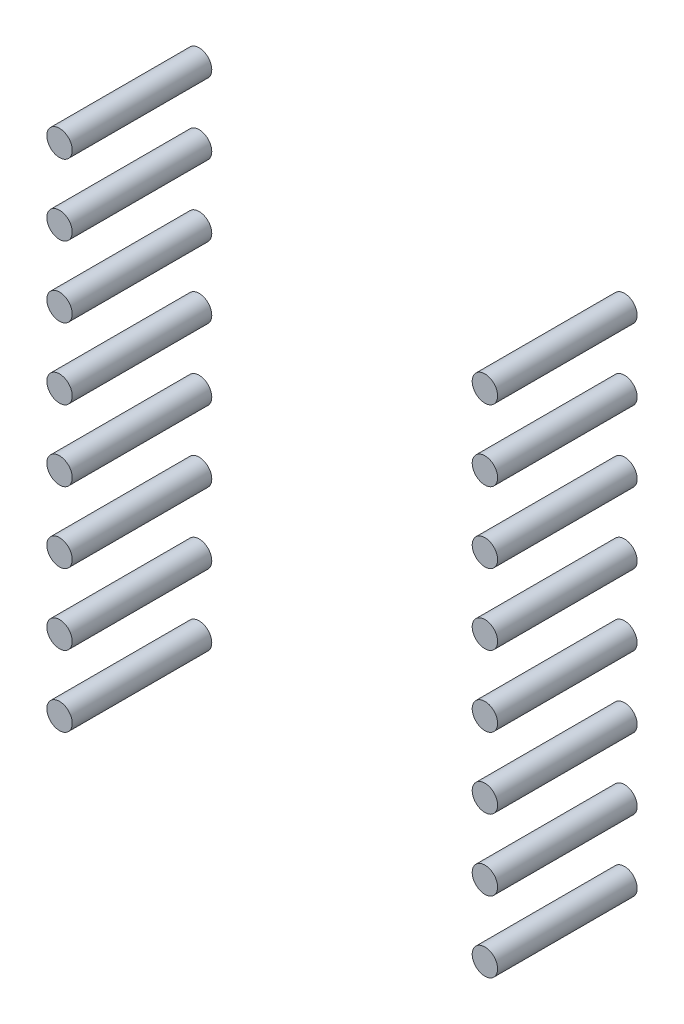
ISO-10303-21;
HEADER;
FILE_DESCRIPTION(('STEP AP214'),'2;1');
FILE_NAME('part.step','',(''),(''),'','','');
FILE_SCHEMA(('AUTOMOTIVE_DESIGN { 1 0 10303 214 1 1 1 1 }'));
ENDSEC;
DATA;
#1=APPLICATION_CONTEXT('core data for automotive mechanical design processes');
#2=APPLICATION_PROTOCOL_DEFINITION('international standard','automotive_design',2000,#1);
#3=PRODUCT_CONTEXT('',#1,'mechanical');
#4=PRODUCT('Part','Part','',(#3));
#5=PRODUCT_RELATED_PRODUCT_CATEGORY('part','',(#4));
#6=PRODUCT_DEFINITION_FORMATION('','',#4);
#7=PRODUCT_DEFINITION_CONTEXT('part definition',#1,'design');
#8=PRODUCT_DEFINITION('design','',#6,#7);
#9=PRODUCT_DEFINITION_SHAPE('','',#8);
#10=(LENGTH_UNIT() NAMED_UNIT(*) SI_UNIT(.MILLI.,.METRE.));
#11=(NAMED_UNIT(*) PLANE_ANGLE_UNIT() SI_UNIT($,.RADIAN.));
#12=(NAMED_UNIT(*) SI_UNIT($,.STERADIAN.) SOLID_ANGLE_UNIT());
#13=UNCERTAINTY_MEASURE_WITH_UNIT(LENGTH_MEASURE(1.E-05),#10,'distance_accuracy_value','');
#14=(GEOMETRIC_REPRESENTATION_CONTEXT(3) GLOBAL_UNCERTAINTY_ASSIGNED_CONTEXT((#13)) GLOBAL_UNIT_ASSIGNED_CONTEXT((#10,
#11,#12)) REPRESENTATION_CONTEXT('',''));
#15=CARTESIAN_POINT('',(0.,0.,0.));
#16=DIRECTION('',(0.,0.,1.));
#17=DIRECTION('',(1.,0.,0.));
#18=AXIS2_PLACEMENT_3D('',#15,#16,#17);
#19=CARTESIAN_POINT('',(0.,-7.62,0.));
#20=DIRECTION('',(0.,0.,1.));
#21=DIRECTION('',(1.,0.,0.));
#22=AXIS2_PLACEMENT_3D('',#19,#20,#21);
#23=PLANE('',#22);
#24=CARTESIAN_POINT('',(0.,-7.62,0.));
#25=DIRECTION('',(0.,0.,1.));
#26=DIRECTION('',(1.,0.,0.));
#27=AXIS2_PLACEMENT_3D('',#24,#25,#26);
#28=CIRCLE('',#27,0.455);
#29=CARTESIAN_POINT('',(0.455,-7.62,0.));
#30=VERTEX_POINT('',#29);
#31=EDGE_CURVE('P0_E18',#30,#30,#28,.F.);
#32=ORIENTED_EDGE('',*,*,#31,.F.);
#33=EDGE_LOOP('',(#32));
#34=FACE_BOUND('',#33,.T.);
#35=ADVANCED_FACE('P0_F15',(#34),#23,.T.);
#36=CARTESIAN_POINT('',(0.,-7.62,-5.));
#37=DIRECTION('',(0.,0.,1.));
#38=DIRECTION('',(1.,0.,0.));
#39=AXIS2_PLACEMENT_3D('',#36,#37,#38);
#40=PLANE('',#39);
#41=CARTESIAN_POINT('',(0.,-7.62,-5.));
#42=DIRECTION('',(0.,0.,1.));
#43=DIRECTION('',(1.,0.,0.));
#44=AXIS2_PLACEMENT_3D('',#41,#42,#43);
#45=CIRCLE('',#44,0.455);
#46=CARTESIAN_POINT('',(0.455,-7.62,-5.));
#47=VERTEX_POINT('',#46);
#48=EDGE_CURVE('P0_E10',#47,#47,#45,.T.);
#49=ORIENTED_EDGE('',*,*,#48,.F.);
#50=EDGE_LOOP('',(#49));
#51=FACE_BOUND('',#50,.T.);
#52=ADVANCED_FACE('P0_F30',(#51),#40,.F.);
#53=CARTESIAN_POINT('',(0.,-7.62,-5.));
#54=DIRECTION('',(0.,0.,1.));
#55=DIRECTION('',(1.,0.,0.));
#56=AXIS2_PLACEMENT_3D('',#53,#54,#55);
#57=CYLINDRICAL_SURFACE('',#56,0.455);
#58=ORIENTED_EDGE('',*,*,#48,.T.);
#59=EDGE_LOOP('',(#58));
#60=FACE_BOUND('',#59,.T.);
#61=ORIENTED_EDGE('',*,*,#31,.T.);
#62=EDGE_LOOP('',(#61));
#63=FACE_BOUND('',#62,.T.);
#64=ADVANCED_FACE('P0_F27',(#60,#63),#57,.T.);
#65=CLOSED_SHELL('',(#35,#52,#64));
#66=MANIFOLD_SOLID_BREP('P0_B1',#65);
#67=CARTESIAN_POINT('',(15.24,0.,0.));
#68=DIRECTION('',(0.,0.,1.));
#69=DIRECTION('',(1.,0.,0.));
#70=AXIS2_PLACEMENT_3D('',#67,#68,#69);
#71=PLANE('',#70);
#72=CARTESIAN_POINT('',(15.24,0.,0.));
#73=DIRECTION('',(0.,0.,1.));
#74=DIRECTION('',(1.,0.,0.));
#75=AXIS2_PLACEMENT_3D('',#72,#73,#74);
#76=CIRCLE('',#75,0.455);
#77=CARTESIAN_POINT('',(15.695,0.,0.));
#78=VERTEX_POINT('',#77);
#79=EDGE_CURVE('P1_E18',#78,#78,#76,.F.);
#80=ORIENTED_EDGE('',*,*,#79,.F.);
#81=EDGE_LOOP('',(#80));
#82=FACE_BOUND('',#81,.T.);
#83=ADVANCED_FACE('P1_F15',(#82),#71,.T.);
#84=CARTESIAN_POINT('',(15.24,0.,-5.));
#85=DIRECTION('',(0.,0.,1.));
#86=DIRECTION('',(1.,0.,0.));
#87=AXIS2_PLACEMENT_3D('',#84,#85,#86);
#88=PLANE('',#87);
#89=CARTESIAN_POINT('',(15.24,0.,-5.));
#90=DIRECTION('',(0.,0.,1.));
#91=DIRECTION('',(1.,0.,0.));
#92=AXIS2_PLACEMENT_3D('',#89,#90,#91);
#93=CIRCLE('',#92,0.455);
#94=CARTESIAN_POINT('',(15.695,0.,-5.));
#95=VERTEX_POINT('',#94);
#96=EDGE_CURVE('P1_E10',#95,#95,#93,.T.);
#97=ORIENTED_EDGE('',*,*,#96,.F.);
#98=EDGE_LOOP('',(#97));
#99=FACE_BOUND('',#98,.T.);
#100=ADVANCED_FACE('P1_F30',(#99),#88,.F.);
#101=CARTESIAN_POINT('',(15.24,0.,-5.));
#102=DIRECTION('',(0.,0.,1.));
#103=DIRECTION('',(1.,0.,0.));
#104=AXIS2_PLACEMENT_3D('',#101,#102,#103);
#105=CYLINDRICAL_SURFACE('',#104,0.455);
#106=ORIENTED_EDGE('',*,*,#96,.T.);
#107=EDGE_LOOP('',(#106));
#108=FACE_BOUND('',#107,.T.);
#109=ORIENTED_EDGE('',*,*,#79,.T.);
#110=EDGE_LOOP('',(#109));
#111=FACE_BOUND('',#110,.T.);
#112=ADVANCED_FACE('P1_F27',(#108,#111),#105,.T.);
#113=CLOSED_SHELL('',(#83,#100,#112));
#114=MANIFOLD_SOLID_BREP('P1_B1',#113);
#115=CARTESIAN_POINT('',(15.24,-5.08,0.));
#116=DIRECTION('',(0.,0.,1.));
#117=DIRECTION('',(1.,0.,0.));
#118=AXIS2_PLACEMENT_3D('',#115,#116,#117);
#119=PLANE('',#118);
#120=CARTESIAN_POINT('',(15.24,-5.08,0.));
#121=DIRECTION('',(0.,0.,1.));
#122=DIRECTION('',(1.,0.,0.));
#123=AXIS2_PLACEMENT_3D('',#120,#121,#122);
#124=CIRCLE('',#123,0.455);
#125=CARTESIAN_POINT('',(15.695,-5.08,0.));
#126=VERTEX_POINT('',#125);
#127=EDGE_CURVE('P2_E18',#126,#126,#124,.F.);
#128=ORIENTED_EDGE('',*,*,#127,.F.);
#129=EDGE_LOOP('',(#128));
#130=FACE_BOUND('',#129,.T.);
#131=ADVANCED_FACE('P2_F15',(#130),#119,.T.);
#132=CARTESIAN_POINT('',(15.24,-5.08,-5.));
#133=DIRECTION('',(0.,0.,1.));
#134=DIRECTION('',(1.,0.,0.));
#135=AXIS2_PLACEMENT_3D('',#132,#133,#134);
#136=PLANE('',#135);
#137=CARTESIAN_POINT('',(15.24,-5.08,-5.));
#138=DIRECTION('',(0.,0.,1.));
#139=DIRECTION('',(1.,0.,0.));
#140=AXIS2_PLACEMENT_3D('',#137,#138,#139);
#141=CIRCLE('',#140,0.455);
#142=CARTESIAN_POINT('',(15.695,-5.08,-5.));
#143=VERTEX_POINT('',#142);
#144=EDGE_CURVE('P2_E10',#143,#143,#141,.T.);
#145=ORIENTED_EDGE('',*,*,#144,.F.);
#146=EDGE_LOOP('',(#145));
#147=FACE_BOUND('',#146,.T.);
#148=ADVANCED_FACE('P2_F30',(#147),#136,.F.);
#149=CARTESIAN_POINT('',(15.24,-5.08,-5.));
#150=DIRECTION('',(0.,0.,1.));
#151=DIRECTION('',(1.,0.,0.));
#152=AXIS2_PLACEMENT_3D('',#149,#150,#151);
#153=CYLINDRICAL_SURFACE('',#152,0.455);
#154=ORIENTED_EDGE('',*,*,#144,.T.);
#155=EDGE_LOOP('',(#154));
#156=FACE_BOUND('',#155,.T.);
#157=ORIENTED_EDGE('',*,*,#127,.T.);
#158=EDGE_LOOP('',(#157));
#159=FACE_BOUND('',#158,.T.);
#160=ADVANCED_FACE('P2_F27',(#156,#159),#153,.T.);
#161=CLOSED_SHELL('',(#131,#148,#160));
#162=MANIFOLD_SOLID_BREP('P2_B1',#161);
#163=CARTESIAN_POINT('',(15.24,-10.16,0.));
#164=DIRECTION('',(0.,0.,1.));
#165=DIRECTION('',(1.,0.,0.));
#166=AXIS2_PLACEMENT_3D('',#163,#164,#165);
#167=PLANE('',#166);
#168=CARTESIAN_POINT('',(15.24,-10.16,0.));
#169=DIRECTION('',(0.,0.,1.));
#170=DIRECTION('',(1.,0.,0.));
#171=AXIS2_PLACEMENT_3D('',#168,#169,#170);
#172=CIRCLE('',#171,0.455);
#173=CARTESIAN_POINT('',(15.695,-10.16,0.));
#174=VERTEX_POINT('',#173);
#175=EDGE_CURVE('P3_E18',#174,#174,#172,.F.);
#176=ORIENTED_EDGE('',*,*,#175,.F.);
#177=EDGE_LOOP('',(#176));
#178=FACE_BOUND('',#177,.T.);
#179=ADVANCED_FACE('P3_F15',(#178),#167,.T.);
#180=CARTESIAN_POINT('',(15.24,-10.16,-5.));
#181=DIRECTION('',(0.,0.,1.));
#182=DIRECTION('',(1.,0.,0.));
#183=AXIS2_PLACEMENT_3D('',#180,#181,#182);
#184=PLANE('',#183);
#185=CARTESIAN_POINT('',(15.24,-10.16,-5.));
#186=DIRECTION('',(0.,0.,1.));
#187=DIRECTION('',(1.,0.,0.));
#188=AXIS2_PLACEMENT_3D('',#185,#186,#187);
#189=CIRCLE('',#188,0.455);
#190=CARTESIAN_POINT('',(15.695,-10.16,-5.));
#191=VERTEX_POINT('',#190);
#192=EDGE_CURVE('P3_E10',#191,#191,#189,.T.);
#193=ORIENTED_EDGE('',*,*,#192,.F.);
#194=EDGE_LOOP('',(#193));
#195=FACE_BOUND('',#194,.T.);
#196=ADVANCED_FACE('P3_F30',(#195),#184,.F.);
#197=CARTESIAN_POINT('',(15.24,-10.16,-5.));
#198=DIRECTION('',(0.,0.,1.));
#199=DIRECTION('',(1.,0.,0.));
#200=AXIS2_PLACEMENT_3D('',#197,#198,#199);
#201=CYLINDRICAL_SURFACE('',#200,0.455);
#202=ORIENTED_EDGE('',*,*,#192,.T.);
#203=EDGE_LOOP('',(#202));
#204=FACE_BOUND('',#203,.T.);
#205=ORIENTED_EDGE('',*,*,#175,.T.);
#206=EDGE_LOOP('',(#205));
#207=FACE_BOUND('',#206,.T.);
#208=ADVANCED_FACE('P3_F27',(#204,#207),#201,.T.);
#209=CLOSED_SHELL('',(#179,#196,#208));
#210=MANIFOLD_SOLID_BREP('P3_B1',#209);
#211=CARTESIAN_POINT('',(0.,-2.54,0.));
#212=DIRECTION('',(0.,0.,1.));
#213=DIRECTION('',(1.,0.,0.));
#214=AXIS2_PLACEMENT_3D('',#211,#212,#213);
#215=PLANE('',#214);
#216=CARTESIAN_POINT('',(0.,-2.54,0.));
#217=DIRECTION('',(0.,0.,1.));
#218=DIRECTION('',(1.,0.,0.));
#219=AXIS2_PLACEMENT_3D('',#216,#217,#218);
#220=CIRCLE('',#219,0.455);
#221=CARTESIAN_POINT('',(0.455,-2.54,0.));
#222=VERTEX_POINT('',#221);
#223=EDGE_CURVE('P4_E18',#222,#222,#220,.F.);
#224=ORIENTED_EDGE('',*,*,#223,.F.);
#225=EDGE_LOOP('',(#224));
#226=FACE_BOUND('',#225,.T.);
#227=ADVANCED_FACE('P4_F15',(#226),#215,.T.);
#228=CARTESIAN_POINT('',(0.,-2.54,-5.));
#229=DIRECTION('',(0.,0.,1.));
#230=DIRECTION('',(1.,0.,0.));
#231=AXIS2_PLACEMENT_3D('',#228,#229,#230);
#232=PLANE('',#231);
#233=CARTESIAN_POINT('',(0.,-2.54,-5.));
#234=DIRECTION('',(0.,0.,1.));
#235=DIRECTION('',(1.,0.,0.));
#236=AXIS2_PLACEMENT_3D('',#233,#234,#235);
#237=CIRCLE('',#236,0.455);
#238=CARTESIAN_POINT('',(0.455,-2.54,-5.));
#239=VERTEX_POINT('',#238);
#240=EDGE_CURVE('P4_E10',#239,#239,#237,.T.);
#241=ORIENTED_EDGE('',*,*,#240,.F.);
#242=EDGE_LOOP('',(#241));
#243=FACE_BOUND('',#242,.T.);
#244=ADVANCED_FACE('P4_F30',(#243),#232,.F.);
#245=CARTESIAN_POINT('',(0.,-2.54,-5.));
#246=DIRECTION('',(0.,0.,1.));
#247=DIRECTION('',(1.,0.,0.));
#248=AXIS2_PLACEMENT_3D('',#245,#246,#247);
#249=CYLINDRICAL_SURFACE('',#248,0.455);
#250=ORIENTED_EDGE('',*,*,#240,.T.);
#251=EDGE_LOOP('',(#250));
#252=FACE_BOUND('',#251,.T.);
#253=ORIENTED_EDGE('',*,*,#223,.T.);
#254=EDGE_LOOP('',(#253));
#255=FACE_BOUND('',#254,.T.);
#256=ADVANCED_FACE('P4_F27',(#252,#255),#249,.T.);
#257=CLOSED_SHELL('',(#227,#244,#256));
#258=MANIFOLD_SOLID_BREP('P4_B1',#257);
#259=CARTESIAN_POINT('',(0.,-15.24,0.));
#260=DIRECTION('',(0.,0.,1.));
#261=DIRECTION('',(1.,0.,0.));
#262=AXIS2_PLACEMENT_3D('',#259,#260,#261);
#263=PLANE('',#262);
#264=CARTESIAN_POINT('',(0.,-15.24,0.));
#265=DIRECTION('',(0.,0.,1.));
#266=DIRECTION('',(1.,0.,0.));
#267=AXIS2_PLACEMENT_3D('',#264,#265,#266);
#268=CIRCLE('',#267,0.455);
#269=CARTESIAN_POINT('',(0.455,-15.24,0.));
#270=VERTEX_POINT('',#269);
#271=EDGE_CURVE('P5_E18',#270,#270,#268,.F.);
#272=ORIENTED_EDGE('',*,*,#271,.F.);
#273=EDGE_LOOP('',(#272));
#274=FACE_BOUND('',#273,.T.);
#275=ADVANCED_FACE('P5_F15',(#274),#263,.T.);
#276=CARTESIAN_POINT('',(0.,-15.24,-5.));
#277=DIRECTION('',(0.,0.,1.));
#278=DIRECTION('',(1.,0.,0.));
#279=AXIS2_PLACEMENT_3D('',#276,#277,#278);
#280=PLANE('',#279);
#281=CARTESIAN_POINT('',(0.,-15.24,-5.));
#282=DIRECTION('',(0.,0.,1.));
#283=DIRECTION('',(1.,0.,0.));
#284=AXIS2_PLACEMENT_3D('',#281,#282,#283);
#285=CIRCLE('',#284,0.455);
#286=CARTESIAN_POINT('',(0.455,-15.24,-5.));
#287=VERTEX_POINT('',#286);
#288=EDGE_CURVE('P5_E10',#287,#287,#285,.T.);
#289=ORIENTED_EDGE('',*,*,#288,.F.);
#290=EDGE_LOOP('',(#289));
#291=FACE_BOUND('',#290,.T.);
#292=ADVANCED_FACE('P5_F30',(#291),#280,.F.);
#293=CARTESIAN_POINT('',(0.,-15.24,-5.));
#294=DIRECTION('',(0.,0.,1.));
#295=DIRECTION('',(1.,0.,0.));
#296=AXIS2_PLACEMENT_3D('',#293,#294,#295);
#297=CYLINDRICAL_SURFACE('',#296,0.455);
#298=ORIENTED_EDGE('',*,*,#288,.T.);
#299=EDGE_LOOP('',(#298));
#300=FACE_BOUND('',#299,.T.);
#301=ORIENTED_EDGE('',*,*,#271,.T.);
#302=EDGE_LOOP('',(#301));
#303=FACE_BOUND('',#302,.T.);
#304=ADVANCED_FACE('P5_F27',(#300,#303),#297,.T.);
#305=CLOSED_SHELL('',(#275,#292,#304));
#306=MANIFOLD_SOLID_BREP('P5_B1',#305);
#307=CARTESIAN_POINT('',(15.24,-7.62,0.));
#308=DIRECTION('',(0.,0.,1.));
#309=DIRECTION('',(1.,0.,0.));
#310=AXIS2_PLACEMENT_3D('',#307,#308,#309);
#311=PLANE('',#310);
#312=CARTESIAN_POINT('',(15.24,-7.62,0.));
#313=DIRECTION('',(0.,0.,1.));
#314=DIRECTION('',(1.,0.,0.));
#315=AXIS2_PLACEMENT_3D('',#312,#313,#314);
#316=CIRCLE('',#315,0.455);
#317=CARTESIAN_POINT('',(15.695,-7.62,0.));
#318=VERTEX_POINT('',#317);
#319=EDGE_CURVE('P6_E18',#318,#318,#316,.F.);
#320=ORIENTED_EDGE('',*,*,#319,.F.);
#321=EDGE_LOOP('',(#320));
#322=FACE_BOUND('',#321,.T.);
#323=ADVANCED_FACE('P6_F15',(#322),#311,.T.);
#324=CARTESIAN_POINT('',(15.24,-7.62,-5.));
#325=DIRECTION('',(0.,0.,1.));
#326=DIRECTION('',(1.,0.,0.));
#327=AXIS2_PLACEMENT_3D('',#324,#325,#326);
#328=PLANE('',#327);
#329=CARTESIAN_POINT('',(15.24,-7.62,-5.));
#330=DIRECTION('',(0.,0.,1.));
#331=DIRECTION('',(1.,0.,0.));
#332=AXIS2_PLACEMENT_3D('',#329,#330,#331);
#333=CIRCLE('',#332,0.455);
#334=CARTESIAN_POINT('',(15.695,-7.62,-5.));
#335=VERTEX_POINT('',#334);
#336=EDGE_CURVE('P6_E10',#335,#335,#333,.T.);
#337=ORIENTED_EDGE('',*,*,#336,.F.);
#338=EDGE_LOOP('',(#337));
#339=FACE_BOUND('',#338,.T.);
#340=ADVANCED_FACE('P6_F30',(#339),#328,.F.);
#341=CARTESIAN_POINT('',(15.24,-7.62,-5.));
#342=DIRECTION('',(0.,0.,1.));
#343=DIRECTION('',(1.,0.,0.));
#344=AXIS2_PLACEMENT_3D('',#341,#342,#343);
#345=CYLINDRICAL_SURFACE('',#344,0.455);
#346=ORIENTED_EDGE('',*,*,#336,.T.);
#347=EDGE_LOOP('',(#346));
#348=FACE_BOUND('',#347,.T.);
#349=ORIENTED_EDGE('',*,*,#319,.T.);
#350=EDGE_LOOP('',(#349));
#351=FACE_BOUND('',#350,.T.);
#352=ADVANCED_FACE('P6_F27',(#348,#351),#345,.T.);
#353=CLOSED_SHELL('',(#323,#340,#352));
#354=MANIFOLD_SOLID_BREP('P6_B1',#353);
#355=CARTESIAN_POINT('',(0.,-5.08,0.));
#356=DIRECTION('',(0.,0.,1.));
#357=DIRECTION('',(1.,0.,0.));
#358=AXIS2_PLACEMENT_3D('',#355,#356,#357);
#359=PLANE('',#358);
#360=CARTESIAN_POINT('',(0.,-5.08,0.));
#361=DIRECTION('',(0.,0.,1.));
#362=DIRECTION('',(1.,0.,0.));
#363=AXIS2_PLACEMENT_3D('',#360,#361,#362);
#364=CIRCLE('',#363,0.455);
#365=CARTESIAN_POINT('',(0.455,-5.08,0.));
#366=VERTEX_POINT('',#365);
#367=EDGE_CURVE('P7_E18',#366,#366,#364,.F.);
#368=ORIENTED_EDGE('',*,*,#367,.F.);
#369=EDGE_LOOP('',(#368));
#370=FACE_BOUND('',#369,.T.);
#371=ADVANCED_FACE('P7_F15',(#370),#359,.T.);
#372=CARTESIAN_POINT('',(0.,-5.08,-5.));
#373=DIRECTION('',(0.,0.,1.));
#374=DIRECTION('',(1.,0.,0.));
#375=AXIS2_PLACEMENT_3D('',#372,#373,#374);
#376=PLANE('',#375);
#377=CARTESIAN_POINT('',(0.,-5.08,-5.));
#378=DIRECTION('',(0.,0.,1.));
#379=DIRECTION('',(1.,0.,0.));
#380=AXIS2_PLACEMENT_3D('',#377,#378,#379);
#381=CIRCLE('',#380,0.455);
#382=CARTESIAN_POINT('',(0.455,-5.08,-5.));
#383=VERTEX_POINT('',#382);
#384=EDGE_CURVE('P7_E10',#383,#383,#381,.T.);
#385=ORIENTED_EDGE('',*,*,#384,.F.);
#386=EDGE_LOOP('',(#385));
#387=FACE_BOUND('',#386,.T.);
#388=ADVANCED_FACE('P7_F30',(#387),#376,.F.);
#389=CARTESIAN_POINT('',(0.,-5.08,-5.));
#390=DIRECTION('',(0.,0.,1.));
#391=DIRECTION('',(1.,0.,0.));
#392=AXIS2_PLACEMENT_3D('',#389,#390,#391);
#393=CYLINDRICAL_SURFACE('',#392,0.455);
#394=ORIENTED_EDGE('',*,*,#384,.T.);
#395=EDGE_LOOP('',(#394));
#396=FACE_BOUND('',#395,.T.);
#397=ORIENTED_EDGE('',*,*,#367,.T.);
#398=EDGE_LOOP('',(#397));
#399=FACE_BOUND('',#398,.T.);
#400=ADVANCED_FACE('P7_F27',(#396,#399),#393,.T.);
#401=CLOSED_SHELL('',(#371,#388,#400));
#402=MANIFOLD_SOLID_BREP('P7_B1',#401);
#403=CARTESIAN_POINT('',(0.,-12.7,0.));
#404=DIRECTION('',(0.,0.,1.));
#405=DIRECTION('',(1.,0.,0.));
#406=AXIS2_PLACEMENT_3D('',#403,#404,#405);
#407=PLANE('',#406);
#408=CARTESIAN_POINT('',(0.,-12.7,0.));
#409=DIRECTION('',(0.,0.,1.));
#410=DIRECTION('',(1.,0.,0.));
#411=AXIS2_PLACEMENT_3D('',#408,#409,#410);
#412=CIRCLE('',#411,0.455);
#413=CARTESIAN_POINT('',(0.455,-12.7,0.));
#414=VERTEX_POINT('',#413);
#415=EDGE_CURVE('P8_E18',#414,#414,#412,.F.);
#416=ORIENTED_EDGE('',*,*,#415,.F.);
#417=EDGE_LOOP('',(#416));
#418=FACE_BOUND('',#417,.T.);
#419=ADVANCED_FACE('P8_F15',(#418),#407,.T.);
#420=CARTESIAN_POINT('',(0.,-12.7,-5.));
#421=DIRECTION('',(0.,0.,1.));
#422=DIRECTION('',(1.,0.,0.));
#423=AXIS2_PLACEMENT_3D('',#420,#421,#422);
#424=PLANE('',#423);
#425=CARTESIAN_POINT('',(0.,-12.7,-5.));
#426=DIRECTION('',(0.,0.,1.));
#427=DIRECTION('',(1.,0.,0.));
#428=AXIS2_PLACEMENT_3D('',#425,#426,#427);
#429=CIRCLE('',#428,0.455);
#430=CARTESIAN_POINT('',(0.455,-12.7,-5.));
#431=VERTEX_POINT('',#430);
#432=EDGE_CURVE('P8_E10',#431,#431,#429,.T.);
#433=ORIENTED_EDGE('',*,*,#432,.F.);
#434=EDGE_LOOP('',(#433));
#435=FACE_BOUND('',#434,.T.);
#436=ADVANCED_FACE('P8_F30',(#435),#424,.F.);
#437=CARTESIAN_POINT('',(0.,-12.7,-5.));
#438=DIRECTION('',(0.,0.,1.));
#439=DIRECTION('',(1.,0.,0.));
#440=AXIS2_PLACEMENT_3D('',#437,#438,#439);
#441=CYLINDRICAL_SURFACE('',#440,0.455);
#442=ORIENTED_EDGE('',*,*,#432,.T.);
#443=EDGE_LOOP('',(#442));
#444=FACE_BOUND('',#443,.T.);
#445=ORIENTED_EDGE('',*,*,#415,.T.);
#446=EDGE_LOOP('',(#445));
#447=FACE_BOUND('',#446,.T.);
#448=ADVANCED_FACE('P8_F27',(#444,#447),#441,.T.);
#449=CLOSED_SHELL('',(#419,#436,#448));
#450=MANIFOLD_SOLID_BREP('P8_B1',#449);
#451=CARTESIAN_POINT('',(15.24,-2.54,0.));
#452=DIRECTION('',(0.,0.,1.));
#453=DIRECTION('',(1.,0.,0.));
#454=AXIS2_PLACEMENT_3D('',#451,#452,#453);
#455=PLANE('',#454);
#456=CARTESIAN_POINT('',(15.24,-2.54,0.));
#457=DIRECTION('',(0.,0.,1.));
#458=DIRECTION('',(1.,0.,0.));
#459=AXIS2_PLACEMENT_3D('',#456,#457,#458);
#460=CIRCLE('',#459,0.455);
#461=CARTESIAN_POINT('',(15.695,-2.54,0.));
#462=VERTEX_POINT('',#461);
#463=EDGE_CURVE('P9_E18',#462,#462,#460,.F.);
#464=ORIENTED_EDGE('',*,*,#463,.F.);
#465=EDGE_LOOP('',(#464));
#466=FACE_BOUND('',#465,.T.);
#467=ADVANCED_FACE('P9_F15',(#466),#455,.T.);
#468=CARTESIAN_POINT('',(15.24,-2.54,-5.));
#469=DIRECTION('',(0.,0.,1.));
#470=DIRECTION('',(1.,0.,0.));
#471=AXIS2_PLACEMENT_3D('',#468,#469,#470);
#472=PLANE('',#471);
#473=CARTESIAN_POINT('',(15.24,-2.54,-5.));
#474=DIRECTION('',(0.,0.,1.));
#475=DIRECTION('',(1.,0.,0.));
#476=AXIS2_PLACEMENT_3D('',#473,#474,#475);
#477=CIRCLE('',#476,0.455);
#478=CARTESIAN_POINT('',(15.695,-2.54,-5.));
#479=VERTEX_POINT('',#478);
#480=EDGE_CURVE('P9_E10',#479,#479,#477,.T.);
#481=ORIENTED_EDGE('',*,*,#480,.F.);
#482=EDGE_LOOP('',(#481));
#483=FACE_BOUND('',#482,.T.);
#484=ADVANCED_FACE('P9_F30',(#483),#472,.F.);
#485=CARTESIAN_POINT('',(15.24,-2.54,-5.));
#486=DIRECTION('',(0.,0.,1.));
#487=DIRECTION('',(1.,0.,0.));
#488=AXIS2_PLACEMENT_3D('',#485,#486,#487);
#489=CYLINDRICAL_SURFACE('',#488,0.455);
#490=ORIENTED_EDGE('',*,*,#480,.T.);
#491=EDGE_LOOP('',(#490));
#492=FACE_BOUND('',#491,.T.);
#493=ORIENTED_EDGE('',*,*,#463,.T.);
#494=EDGE_LOOP('',(#493));
#495=FACE_BOUND('',#494,.T.);
#496=ADVANCED_FACE('P9_F27',(#492,#495),#489,.T.);
#497=CLOSED_SHELL('',(#467,#484,#496));
#498=MANIFOLD_SOLID_BREP('P9_B1',#497);
#499=CARTESIAN_POINT('',(15.24,-17.78,0.));
#500=DIRECTION('',(0.,0.,1.));
#501=DIRECTION('',(1.,0.,0.));
#502=AXIS2_PLACEMENT_3D('',#499,#500,#501);
#503=PLANE('',#502);
#504=CARTESIAN_POINT('',(15.24,-17.78,0.));
#505=DIRECTION('',(0.,0.,1.));
#506=DIRECTION('',(1.,0.,0.));
#507=AXIS2_PLACEMENT_3D('',#504,#505,#506);
#508=CIRCLE('',#507,0.455);
#509=CARTESIAN_POINT('',(15.695,-17.78,0.));
#510=VERTEX_POINT('',#509);
#511=EDGE_CURVE('P10_E18',#510,#510,#508,.F.);
#512=ORIENTED_EDGE('',*,*,#511,.F.);
#513=EDGE_LOOP('',(#512));
#514=FACE_BOUND('',#513,.T.);
#515=ADVANCED_FACE('P10_F15',(#514),#503,.T.);
#516=CARTESIAN_POINT('',(15.24,-17.78,-5.));
#517=DIRECTION('',(0.,0.,1.));
#518=DIRECTION('',(1.,0.,0.));
#519=AXIS2_PLACEMENT_3D('',#516,#517,#518);
#520=PLANE('',#519);
#521=CARTESIAN_POINT('',(15.24,-17.78,-5.));
#522=DIRECTION('',(0.,0.,1.));
#523=DIRECTION('',(1.,0.,0.));
#524=AXIS2_PLACEMENT_3D('',#521,#522,#523);
#525=CIRCLE('',#524,0.455);
#526=CARTESIAN_POINT('',(15.695,-17.78,-5.));
#527=VERTEX_POINT('',#526);
#528=EDGE_CURVE('P10_E10',#527,#527,#525,.T.);
#529=ORIENTED_EDGE('',*,*,#528,.F.);
#530=EDGE_LOOP('',(#529));
#531=FACE_BOUND('',#530,.T.);
#532=ADVANCED_FACE('P10_F30',(#531),#520,.F.);
#533=CARTESIAN_POINT('',(15.24,-17.78,-5.));
#534=DIRECTION('',(0.,0.,1.));
#535=DIRECTION('',(1.,0.,0.));
#536=AXIS2_PLACEMENT_3D('',#533,#534,#535);
#537=CYLINDRICAL_SURFACE('',#536,0.455);
#538=ORIENTED_EDGE('',*,*,#528,.T.);
#539=EDGE_LOOP('',(#538));
#540=FACE_BOUND('',#539,.T.);
#541=ORIENTED_EDGE('',*,*,#511,.T.);
#542=EDGE_LOOP('',(#541));
#543=FACE_BOUND('',#542,.T.);
#544=ADVANCED_FACE('P10_F27',(#540,#543),#537,.T.);
#545=CLOSED_SHELL('',(#515,#532,#544));
#546=MANIFOLD_SOLID_BREP('P10_B1',#545);
#547=CARTESIAN_POINT('',(15.24,-12.7,0.));
#548=DIRECTION('',(0.,0.,1.));
#549=DIRECTION('',(1.,0.,0.));
#550=AXIS2_PLACEMENT_3D('',#547,#548,#549);
#551=PLANE('',#550);
#552=CARTESIAN_POINT('',(15.24,-12.7,0.));
#553=DIRECTION('',(0.,0.,1.));
#554=DIRECTION('',(1.,0.,0.));
#555=AXIS2_PLACEMENT_3D('',#552,#553,#554);
#556=CIRCLE('',#555,0.455);
#557=CARTESIAN_POINT('',(15.695,-12.7,0.));
#558=VERTEX_POINT('',#557);
#559=EDGE_CURVE('P11_E18',#558,#558,#556,.F.);
#560=ORIENTED_EDGE('',*,*,#559,.F.);
#561=EDGE_LOOP('',(#560));
#562=FACE_BOUND('',#561,.T.);
#563=ADVANCED_FACE('P11_F15',(#562),#551,.T.);
#564=CARTESIAN_POINT('',(15.24,-12.7,-5.));
#565=DIRECTION('',(0.,0.,1.));
#566=DIRECTION('',(1.,0.,0.));
#567=AXIS2_PLACEMENT_3D('',#564,#565,#566);
#568=PLANE('',#567);
#569=CARTESIAN_POINT('',(15.24,-12.7,-5.));
#570=DIRECTION('',(0.,0.,1.));
#571=DIRECTION('',(1.,0.,0.));
#572=AXIS2_PLACEMENT_3D('',#569,#570,#571);
#573=CIRCLE('',#572,0.455);
#574=CARTESIAN_POINT('',(15.695,-12.7,-5.));
#575=VERTEX_POINT('',#574);
#576=EDGE_CURVE('P11_E10',#575,#575,#573,.T.);
#577=ORIENTED_EDGE('',*,*,#576,.F.);
#578=EDGE_LOOP('',(#577));
#579=FACE_BOUND('',#578,.T.);
#580=ADVANCED_FACE('P11_F30',(#579),#568,.F.);
#581=CARTESIAN_POINT('',(15.24,-12.7,-5.));
#582=DIRECTION('',(0.,0.,1.));
#583=DIRECTION('',(1.,0.,0.));
#584=AXIS2_PLACEMENT_3D('',#581,#582,#583);
#585=CYLINDRICAL_SURFACE('',#584,0.455);
#586=ORIENTED_EDGE('',*,*,#576,.T.);
#587=EDGE_LOOP('',(#586));
#588=FACE_BOUND('',#587,.T.);
#589=ORIENTED_EDGE('',*,*,#559,.T.);
#590=EDGE_LOOP('',(#589));
#591=FACE_BOUND('',#590,.T.);
#592=ADVANCED_FACE('P11_F27',(#588,#591),#585,.T.);
#593=CLOSED_SHELL('',(#563,#580,#592));
#594=MANIFOLD_SOLID_BREP('P11_B1',#593);
#595=CARTESIAN_POINT('',(15.24,-15.24,0.));
#596=DIRECTION('',(0.,0.,1.));
#597=DIRECTION('',(1.,0.,0.));
#598=AXIS2_PLACEMENT_3D('',#595,#596,#597);
#599=PLANE('',#598);
#600=CARTESIAN_POINT('',(15.24,-15.24,0.));
#601=DIRECTION('',(0.,0.,1.));
#602=DIRECTION('',(1.,0.,0.));
#603=AXIS2_PLACEMENT_3D('',#600,#601,#602);
#604=CIRCLE('',#603,0.455);
#605=CARTESIAN_POINT('',(15.695,-15.24,0.));
#606=VERTEX_POINT('',#605);
#607=EDGE_CURVE('P12_E18',#606,#606,#604,.F.);
#608=ORIENTED_EDGE('',*,*,#607,.F.);
#609=EDGE_LOOP('',(#608));
#610=FACE_BOUND('',#609,.T.);
#611=ADVANCED_FACE('P12_F15',(#610),#599,.T.);
#612=CARTESIAN_POINT('',(15.24,-15.24,-5.));
#613=DIRECTION('',(0.,0.,1.));
#614=DIRECTION('',(1.,0.,0.));
#615=AXIS2_PLACEMENT_3D('',#612,#613,#614);
#616=PLANE('',#615);
#617=CARTESIAN_POINT('',(15.24,-15.24,-5.));
#618=DIRECTION('',(0.,0.,1.));
#619=DIRECTION('',(1.,0.,0.));
#620=AXIS2_PLACEMENT_3D('',#617,#618,#619);
#621=CIRCLE('',#620,0.455);
#622=CARTESIAN_POINT('',(15.695,-15.24,-5.));
#623=VERTEX_POINT('',#622);
#624=EDGE_CURVE('P12_E10',#623,#623,#621,.T.);
#625=ORIENTED_EDGE('',*,*,#624,.F.);
#626=EDGE_LOOP('',(#625));
#627=FACE_BOUND('',#626,.T.);
#628=ADVANCED_FACE('P12_F30',(#627),#616,.F.);
#629=CARTESIAN_POINT('',(15.24,-15.24,-5.));
#630=DIRECTION('',(0.,0.,1.));
#631=DIRECTION('',(1.,0.,0.));
#632=AXIS2_PLACEMENT_3D('',#629,#630,#631);
#633=CYLINDRICAL_SURFACE('',#632,0.455);
#634=ORIENTED_EDGE('',*,*,#624,.T.);
#635=EDGE_LOOP('',(#634));
#636=FACE_BOUND('',#635,.T.);
#637=ORIENTED_EDGE('',*,*,#607,.T.);
#638=EDGE_LOOP('',(#637));
#639=FACE_BOUND('',#638,.T.);
#640=ADVANCED_FACE('P12_F27',(#636,#639),#633,.T.);
#641=CLOSED_SHELL('',(#611,#628,#640));
#642=MANIFOLD_SOLID_BREP('P12_B1',#641);
#643=CARTESIAN_POINT('',(0.,-10.16,0.));
#644=DIRECTION('',(0.,0.,1.));
#645=DIRECTION('',(1.,0.,0.));
#646=AXIS2_PLACEMENT_3D('',#643,#644,#645);
#647=PLANE('',#646);
#648=CARTESIAN_POINT('',(0.,-10.16,0.));
#649=DIRECTION('',(0.,0.,1.));
#650=DIRECTION('',(1.,0.,0.));
#651=AXIS2_PLACEMENT_3D('',#648,#649,#650);
#652=CIRCLE('',#651,0.455);
#653=CARTESIAN_POINT('',(0.455,-10.16,0.));
#654=VERTEX_POINT('',#653);
#655=EDGE_CURVE('P13_E18',#654,#654,#652,.F.);
#656=ORIENTED_EDGE('',*,*,#655,.F.);
#657=EDGE_LOOP('',(#656));
#658=FACE_BOUND('',#657,.T.);
#659=ADVANCED_FACE('P13_F15',(#658),#647,.T.);
#660=CARTESIAN_POINT('',(0.,-10.16,-5.));
#661=DIRECTION('',(0.,0.,1.));
#662=DIRECTION('',(1.,0.,0.));
#663=AXIS2_PLACEMENT_3D('',#660,#661,#662);
#664=PLANE('',#663);
#665=CARTESIAN_POINT('',(0.,-10.16,-5.));
#666=DIRECTION('',(0.,0.,1.));
#667=DIRECTION('',(1.,0.,0.));
#668=AXIS2_PLACEMENT_3D('',#665,#666,#667);
#669=CIRCLE('',#668,0.455);
#670=CARTESIAN_POINT('',(0.455,-10.16,-5.));
#671=VERTEX_POINT('',#670);
#672=EDGE_CURVE('P13_E10',#671,#671,#669,.T.);
#673=ORIENTED_EDGE('',*,*,#672,.F.);
#674=EDGE_LOOP('',(#673));
#675=FACE_BOUND('',#674,.T.);
#676=ADVANCED_FACE('P13_F30',(#675),#664,.F.);
#677=CARTESIAN_POINT('',(0.,-10.16,-5.));
#678=DIRECTION('',(0.,0.,1.));
#679=DIRECTION('',(1.,0.,0.));
#680=AXIS2_PLACEMENT_3D('',#677,#678,#679);
#681=CYLINDRICAL_SURFACE('',#680,0.455);
#682=ORIENTED_EDGE('',*,*,#672,.T.);
#683=EDGE_LOOP('',(#682));
#684=FACE_BOUND('',#683,.T.);
#685=ORIENTED_EDGE('',*,*,#655,.T.);
#686=EDGE_LOOP('',(#685));
#687=FACE_BOUND('',#686,.T.);
#688=ADVANCED_FACE('P13_F27',(#684,#687),#681,.T.);
#689=CLOSED_SHELL('',(#659,#676,#688));
#690=MANIFOLD_SOLID_BREP('P13_B1',#689);
#691=CARTESIAN_POINT('',(0.,0.,0.));
#692=DIRECTION('',(0.,0.,1.));
#693=DIRECTION('',(1.,0.,0.));
#694=AXIS2_PLACEMENT_3D('',#691,#692,#693);
#695=PLANE('',#694);
#696=CARTESIAN_POINT('',(0.,0.,0.));
#697=DIRECTION('',(0.,0.,1.));
#698=DIRECTION('',(1.,0.,0.));
#699=AXIS2_PLACEMENT_3D('',#696,#697,#698);
#700=CIRCLE('',#699,0.455);
#701=CARTESIAN_POINT('',(0.455,0.,0.));
#702=VERTEX_POINT('',#701);
#703=EDGE_CURVE('P14_E18',#702,#702,#700,.F.);
#704=ORIENTED_EDGE('',*,*,#703,.F.);
#705=EDGE_LOOP('',(#704));
#706=FACE_BOUND('',#705,.T.);
#707=ADVANCED_FACE('P14_F15',(#706),#695,.T.);
#708=CARTESIAN_POINT('',(0.,0.,-5.));
#709=DIRECTION('',(0.,0.,1.));
#710=DIRECTION('',(1.,0.,0.));
#711=AXIS2_PLACEMENT_3D('',#708,#709,#710);
#712=PLANE('',#711);
#713=CARTESIAN_POINT('',(0.,0.,-5.));
#714=DIRECTION('',(0.,0.,1.));
#715=DIRECTION('',(1.,0.,0.));
#716=AXIS2_PLACEMENT_3D('',#713,#714,#715);
#717=CIRCLE('',#716,0.455);
#718=CARTESIAN_POINT('',(0.455,0.,-5.));
#719=VERTEX_POINT('',#718);
#720=EDGE_CURVE('P14_E10',#719,#719,#717,.T.);
#721=ORIENTED_EDGE('',*,*,#720,.F.);
#722=EDGE_LOOP('',(#721));
#723=FACE_BOUND('',#722,.T.);
#724=ADVANCED_FACE('P14_F30',(#723),#712,.F.);
#725=CARTESIAN_POINT('',(0.,0.,-5.));
#726=DIRECTION('',(0.,0.,1.));
#727=DIRECTION('',(1.,0.,0.));
#728=AXIS2_PLACEMENT_3D('',#725,#726,#727);
#729=CYLINDRICAL_SURFACE('',#728,0.455);
#730=ORIENTED_EDGE('',*,*,#720,.T.);
#731=EDGE_LOOP('',(#730));
#732=FACE_BOUND('',#731,.T.);
#733=ORIENTED_EDGE('',*,*,#703,.T.);
#734=EDGE_LOOP('',(#733));
#735=FACE_BOUND('',#734,.T.);
#736=ADVANCED_FACE('P14_F27',(#732,#735),#729,.T.);
#737=CLOSED_SHELL('',(#707,#724,#736));
#738=MANIFOLD_SOLID_BREP('P14_B1',#737);
#739=CARTESIAN_POINT('',(0.,-17.78,0.));
#740=DIRECTION('',(0.,0.,1.));
#741=DIRECTION('',(1.,0.,0.));
#742=AXIS2_PLACEMENT_3D('',#739,#740,#741);
#743=PLANE('',#742);
#744=CARTESIAN_POINT('',(0.,-17.78,0.));
#745=DIRECTION('',(0.,0.,1.));
#746=DIRECTION('',(1.,0.,0.));
#747=AXIS2_PLACEMENT_3D('',#744,#745,#746);
#748=CIRCLE('',#747,0.455);
#749=CARTESIAN_POINT('',(0.455,-17.78,0.));
#750=VERTEX_POINT('',#749);
#751=EDGE_CURVE('P15_E18',#750,#750,#748,.F.);
#752=ORIENTED_EDGE('',*,*,#751,.F.);
#753=EDGE_LOOP('',(#752));
#754=FACE_BOUND('',#753,.T.);
#755=ADVANCED_FACE('P15_F15',(#754),#743,.T.);
#756=CARTESIAN_POINT('',(0.,-17.78,-5.));
#757=DIRECTION('',(0.,0.,1.));
#758=DIRECTION('',(1.,0.,0.));
#759=AXIS2_PLACEMENT_3D('',#756,#757,#758);
#760=PLANE('',#759);
#761=CARTESIAN_POINT('',(0.,-17.78,-5.));
#762=DIRECTION('',(0.,0.,1.));
#763=DIRECTION('',(1.,0.,0.));
#764=AXIS2_PLACEMENT_3D('',#761,#762,#763);
#765=CIRCLE('',#764,0.455);
#766=CARTESIAN_POINT('',(0.455,-17.78,-5.));
#767=VERTEX_POINT('',#766);
#768=EDGE_CURVE('P15_E10',#767,#767,#765,.T.);
#769=ORIENTED_EDGE('',*,*,#768,.F.);
#770=EDGE_LOOP('',(#769));
#771=FACE_BOUND('',#770,.T.);
#772=ADVANCED_FACE('P15_F30',(#771),#760,.F.);
#773=CARTESIAN_POINT('',(0.,-17.78,-5.));
#774=DIRECTION('',(0.,0.,1.));
#775=DIRECTION('',(1.,0.,0.));
#776=AXIS2_PLACEMENT_3D('',#773,#774,#775);
#777=CYLINDRICAL_SURFACE('',#776,0.455);
#778=ORIENTED_EDGE('',*,*,#768,.T.);
#779=EDGE_LOOP('',(#778));
#780=FACE_BOUND('',#779,.T.);
#781=ORIENTED_EDGE('',*,*,#751,.T.);
#782=EDGE_LOOP('',(#781));
#783=FACE_BOUND('',#782,.T.);
#784=ADVANCED_FACE('P15_F27',(#780,#783),#777,.T.);
#785=CLOSED_SHELL('',(#755,#772,#784));
#786=MANIFOLD_SOLID_BREP('P15_B1',#785);
#787=ADVANCED_BREP_SHAPE_REPRESENTATION('',(#18,#66,#114,#162,#210,#258,#306,#354,#402,#450,
#498,#546,#594,#642,#690,#738,#786),#14);
#788=SHAPE_DEFINITION_REPRESENTATION(#9,#787);
ENDSEC;
END-ISO-10303-21;
